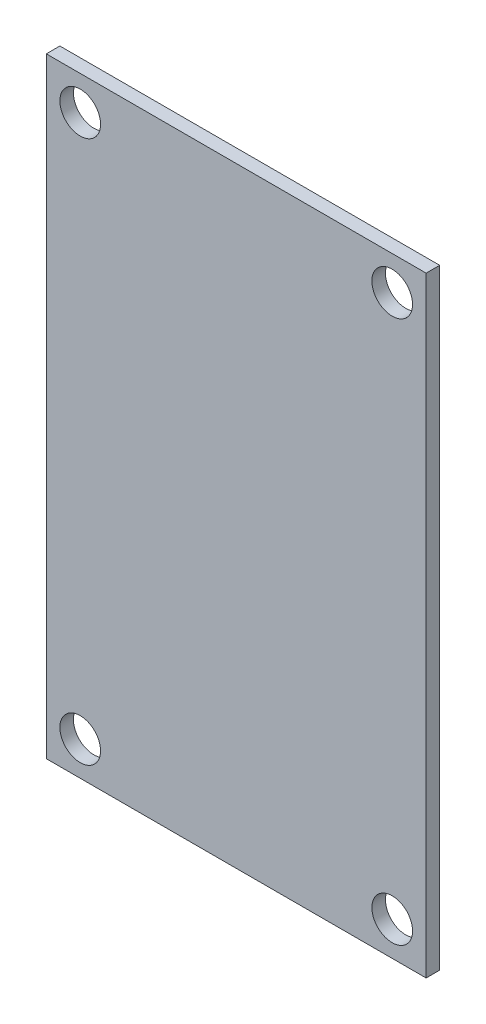
ISO-10303-21;
HEADER;
FILE_DESCRIPTION(('STEP AP214'),'2;1');
FILE_NAME('part.step','',(''),(''),'','','');
FILE_SCHEMA(('AUTOMOTIVE_DESIGN { 1 0 10303 214 1 1 1 1 }'));
ENDSEC;
DATA;
#1=APPLICATION_CONTEXT('core data for automotive mechanical design processes');
#2=APPLICATION_PROTOCOL_DEFINITION('international standard','automotive_design',2000,#1);
#3=PRODUCT_CONTEXT('',#1,'mechanical');
#4=PRODUCT('Part','Part','',(#3));
#5=PRODUCT_RELATED_PRODUCT_CATEGORY('part','',(#4));
#6=PRODUCT_DEFINITION_FORMATION('','',#4);
#7=PRODUCT_DEFINITION_CONTEXT('part definition',#1,'design');
#8=PRODUCT_DEFINITION('design','',#6,#7);
#9=PRODUCT_DEFINITION_SHAPE('','',#8);
#10=(LENGTH_UNIT() NAMED_UNIT(*) SI_UNIT(.MILLI.,.METRE.));
#11=(NAMED_UNIT(*) PLANE_ANGLE_UNIT() SI_UNIT($,.RADIAN.));
#12=(NAMED_UNIT(*) SI_UNIT($,.STERADIAN.) SOLID_ANGLE_UNIT());
#13=UNCERTAINTY_MEASURE_WITH_UNIT(LENGTH_MEASURE(1.E-05),#10,'distance_accuracy_value','');
#14=(GEOMETRIC_REPRESENTATION_CONTEXT(3) GLOBAL_UNCERTAINTY_ASSIGNED_CONTEXT((#13)) GLOBAL_UNIT_ASSIGNED_CONTEXT((#10,
#11,#12)) REPRESENTATION_CONTEXT('',''));
#15=CARTESIAN_POINT('',(0.,0.,0.));
#16=DIRECTION('',(0.,0.,1.));
#17=DIRECTION('',(1.,0.,0.));
#18=AXIS2_PLACEMENT_3D('',#15,#16,#17);
#19=CARTESIAN_POINT('',(0.,0.,1.));
#20=DIRECTION('',(1.,0.,0.));
#21=DIRECTION('',(0.,1.,0.));
#22=AXIS2_PLACEMENT_3D('',#19,#20,#21);
#23=PLANE('',#22);
#24=DIRECTION('',(0.,-1.,0.));
#25=VECTOR('',#24,1.);
#26=CARTESIAN_POINT('',(0.,0.,0.));
#27=LINE('',#26,#25);
#28=CARTESIAN_POINT('',(0.,0.,0.));
#29=VERTEX_POINT('',#28);
#30=CARTESIAN_POINT('',(0.,-45.,0.));
#31=VERTEX_POINT('',#30);
#32=EDGE_CURVE('E97',#29,#31,#27,.T.);
#33=ORIENTED_EDGE('',*,*,#32,.T.);
#34=DIRECTION('',(0.,0.,-1.));
#35=VECTOR('',#34,1.);
#36=CARTESIAN_POINT('',(0.,-45.,1.));
#37=LINE('',#36,#35);
#38=CARTESIAN_POINT('',(0.,-45.,1.));
#39=VERTEX_POINT('',#38);
#40=EDGE_CURVE('E11',#39,#31,#37,.T.);
#41=ORIENTED_EDGE('',*,*,#40,.F.);
#42=DIRECTION('',(0.,-1.,0.));
#43=VECTOR('',#42,1.);
#44=CARTESIAN_POINT('',(0.,0.,1.));
#45=LINE('',#44,#43);
#46=CARTESIAN_POINT('',(0.,0.,1.));
#47=VERTEX_POINT('',#46);
#48=EDGE_CURVE('E85',#47,#39,#45,.T.);
#49=ORIENTED_EDGE('',*,*,#48,.F.);
#50=DIRECTION('',(0.,0.,-1.));
#51=VECTOR('',#50,1.);
#52=CARTESIAN_POINT('',(0.,0.,1.));
#53=LINE('',#52,#51);
#54=EDGE_CURVE('E93',#47,#29,#53,.T.);
#55=ORIENTED_EDGE('',*,*,#54,.T.);
#56=EDGE_LOOP('',(#33,#41,#49,#55));
#57=FACE_BOUND('',#56,.T.);
#58=ADVANCED_FACE('F34',(#57),#23,.F.);
#59=CARTESIAN_POINT('',(0.,-45.,1.));
#60=DIRECTION('',(0.,1.,0.));
#61=DIRECTION('',(0.,0.,1.));
#62=AXIS2_PLACEMENT_3D('',#59,#60,#61);
#63=PLANE('',#62);
#64=DIRECTION('',(1.,0.,0.));
#65=VECTOR('',#64,1.);
#66=CARTESIAN_POINT('',(0.,-45.,0.));
#67=LINE('',#66,#65);
#68=CARTESIAN_POINT('',(28.,-45.,0.));
#69=VERTEX_POINT('',#68);
#70=EDGE_CURVE('E89',#31,#69,#67,.T.);
#71=ORIENTED_EDGE('',*,*,#70,.T.);
#72=DIRECTION('',(0.,0.,-1.));
#73=VECTOR('',#72,1.);
#74=CARTESIAN_POINT('',(28.,-45.,1.));
#75=LINE('',#74,#73);
#76=CARTESIAN_POINT('',(28.,-45.,1.));
#77=VERTEX_POINT('',#76);
#78=EDGE_CURVE('E42',#77,#69,#75,.T.);
#79=ORIENTED_EDGE('',*,*,#78,.F.);
#80=DIRECTION('',(1.,0.,0.));
#81=VECTOR('',#80,1.);
#82=CARTESIAN_POINT('',(0.,-45.,1.));
#83=LINE('',#82,#81);
#84=EDGE_CURVE('E80',#39,#77,#83,.T.);
#85=ORIENTED_EDGE('',*,*,#84,.F.);
#86=ORIENTED_EDGE('',*,*,#40,.T.);
#87=EDGE_LOOP('',(#71,#79,#85,#86));
#88=FACE_BOUND('',#87,.T.);
#89=ADVANCED_FACE('F88',(#88),#63,.F.);
#90=CARTESIAN_POINT('',(28.,0.,1.));
#91=DIRECTION('',(-1.,0.,0.));
#92=DIRECTION('',(0.,-1.,0.));
#93=AXIS2_PLACEMENT_3D('',#90,#91,#92);
#94=PLANE('',#93);
#95=DIRECTION('',(0.,1.,0.));
#96=VECTOR('',#95,1.);
#97=CARTESIAN_POINT('',(28.,0.,0.));
#98=LINE('',#97,#96);
#99=CARTESIAN_POINT('',(28.,0.,0.));
#100=VERTEX_POINT('',#99);
#101=EDGE_CURVE('E67',#69,#100,#98,.T.);
#102=ORIENTED_EDGE('',*,*,#101,.T.);
#103=DIRECTION('',(0.,0.,-1.));
#104=VECTOR('',#103,1.);
#105=CARTESIAN_POINT('',(28.,0.,1.));
#106=LINE('',#105,#104);
#107=CARTESIAN_POINT('',(28.,0.,1.));
#108=VERTEX_POINT('',#107);
#109=EDGE_CURVE('E90',#108,#100,#106,.T.);
#110=ORIENTED_EDGE('',*,*,#109,.F.);
#111=DIRECTION('',(0.,1.,0.));
#112=VECTOR('',#111,1.);
#113=CARTESIAN_POINT('',(28.,0.,1.));
#114=LINE('',#113,#112);
#115=EDGE_CURVE('E83',#77,#108,#114,.T.);
#116=ORIENTED_EDGE('',*,*,#115,.F.);
#117=ORIENTED_EDGE('',*,*,#78,.T.);
#118=EDGE_LOOP('',(#102,#110,#116,#117));
#119=FACE_BOUND('',#118,.T.);
#120=ADVANCED_FACE('F91',(#119),#94,.F.);
#121=CARTESIAN_POINT('',(0.,0.,1.));
#122=DIRECTION('',(0.,-1.,0.));
#123=DIRECTION('',(0.,0.,-1.));
#124=AXIS2_PLACEMENT_3D('',#121,#122,#123);
#125=PLANE('',#124);
#126=DIRECTION('',(-1.,0.,0.));
#127=VECTOR('',#126,1.);
#128=CARTESIAN_POINT('',(0.,0.,0.));
#129=LINE('',#128,#127);
#130=EDGE_CURVE('E73',#100,#29,#129,.T.);
#131=ORIENTED_EDGE('',*,*,#130,.T.);
#132=ORIENTED_EDGE('',*,*,#54,.F.);
#133=DIRECTION('',(-1.,0.,0.));
#134=VECTOR('',#133,1.);
#135=CARTESIAN_POINT('',(0.,0.,1.));
#136=LINE('',#135,#134);
#137=EDGE_CURVE('E50',#108,#47,#136,.T.);
#138=ORIENTED_EDGE('',*,*,#137,.F.);
#139=ORIENTED_EDGE('',*,*,#109,.T.);
#140=EDGE_LOOP('',(#131,#132,#138,#139));
#141=FACE_BOUND('',#140,.T.);
#142=ADVANCED_FACE('F105',(#141),#125,.F.);
#143=CARTESIAN_POINT('',(0.,0.,1.));
#144=DIRECTION('',(0.,0.,1.));
#145=DIRECTION('',(1.,0.,0.));
#146=AXIS2_PLACEMENT_3D('',#143,#144,#145);
#147=PLANE('',#146);
#148=CARTESIAN_POINT('',(25.5,-2.49999999999998,1.));
#149=DIRECTION('',(0.,0.,1.));
#150=DIRECTION('',(1.,0.,0.));
#151=AXIS2_PLACEMENT_3D('',#148,#149,#150);
#152=CIRCLE('',#151,1.5);
#153=CARTESIAN_POINT('',(27.,-2.49999999999998,1.));
#154=VERTEX_POINT('',#153);
#155=EDGE_CURVE('E129',#154,#154,#152,.T.);
#156=ORIENTED_EDGE('',*,*,#155,.F.);
#157=EDGE_LOOP('',(#156));
#158=FACE_BOUND('',#157,.T.);
#159=CARTESIAN_POINT('',(25.5,-42.5,1.));
#160=DIRECTION('',(0.,0.,1.));
#161=DIRECTION('',(-1.,0.,0.));
#162=AXIS2_PLACEMENT_3D('',#159,#160,#161);
#163=CIRCLE('',#162,1.5);
#164=CARTESIAN_POINT('',(24.,-42.5,1.));
#165=VERTEX_POINT('',#164);
#166=EDGE_CURVE('E123',#165,#165,#163,.T.);
#167=ORIENTED_EDGE('',*,*,#166,.F.);
#168=EDGE_LOOP('',(#167));
#169=FACE_BOUND('',#168,.T.);
#170=CARTESIAN_POINT('',(2.50000000000002,-2.49999999999999,1.));
#171=DIRECTION('',(0.,0.,1.));
#172=DIRECTION('',(-1.,0.,0.));
#173=AXIS2_PLACEMENT_3D('',#170,#171,#172);
#174=CIRCLE('',#173,1.5);
#175=CARTESIAN_POINT('',(1.00000000000002,-2.49999999999999,1.));
#176=VERTEX_POINT('',#175);
#177=EDGE_CURVE('E117',#176,#176,#174,.T.);
#178=ORIENTED_EDGE('',*,*,#177,.F.);
#179=EDGE_LOOP('',(#178));
#180=FACE_BOUND('',#179,.T.);
#181=CARTESIAN_POINT('',(2.5,-42.5,1.));
#182=DIRECTION('',(0.,0.,1.));
#183=DIRECTION('',(1.,0.,0.));
#184=AXIS2_PLACEMENT_3D('',#181,#182,#183);
#185=CIRCLE('',#184,1.5);
#186=CARTESIAN_POINT('',(4.,-42.5,1.));
#187=VERTEX_POINT('',#186);
#188=EDGE_CURVE('E111',#187,#187,#185,.T.);
#189=ORIENTED_EDGE('',*,*,#188,.F.);
#190=EDGE_LOOP('',(#189));
#191=FACE_BOUND('',#190,.T.);
#192=ORIENTED_EDGE('',*,*,#48,.T.);
#193=ORIENTED_EDGE('',*,*,#84,.T.);
#194=ORIENTED_EDGE('',*,*,#115,.T.);
#195=ORIENTED_EDGE('',*,*,#137,.T.);
#196=EDGE_LOOP('',(#192,#193,#194,#195));
#197=FACE_BOUND('',#196,.T.);
#198=ADVANCED_FACE('F81',(#158,#169,#180,#191,#197),#147,.T.);
#199=CARTESIAN_POINT('',(0.,0.,0.));
#200=DIRECTION('',(0.,0.,1.));
#201=DIRECTION('',(1.,0.,0.));
#202=AXIS2_PLACEMENT_3D('',#199,#200,#201);
#203=PLANE('',#202);
#204=CARTESIAN_POINT('',(25.5,-2.49999999999998,0.));
#205=DIRECTION('',(0.,0.,1.));
#206=DIRECTION('',(1.,0.,0.));
#207=AXIS2_PLACEMENT_3D('',#204,#205,#206);
#208=CIRCLE('',#207,1.5);
#209=CARTESIAN_POINT('',(27.,-2.49999999999998,0.));
#210=VERTEX_POINT('',#209);
#211=EDGE_CURVE('E126',#210,#210,#208,.T.);
#212=ORIENTED_EDGE('',*,*,#211,.T.);
#213=EDGE_LOOP('',(#212));
#214=FACE_BOUND('',#213,.T.);
#215=CARTESIAN_POINT('',(25.5,-42.5,0.));
#216=DIRECTION('',(0.,0.,1.));
#217=DIRECTION('',(-1.,0.,0.));
#218=AXIS2_PLACEMENT_3D('',#215,#216,#217);
#219=CIRCLE('',#218,1.5);
#220=CARTESIAN_POINT('',(24.,-42.5,0.));
#221=VERTEX_POINT('',#220);
#222=EDGE_CURVE('E120',#221,#221,#219,.T.);
#223=ORIENTED_EDGE('',*,*,#222,.T.);
#224=EDGE_LOOP('',(#223));
#225=FACE_BOUND('',#224,.T.);
#226=CARTESIAN_POINT('',(2.50000000000002,-2.49999999999999,0.));
#227=DIRECTION('',(0.,0.,1.));
#228=DIRECTION('',(-1.,0.,0.));
#229=AXIS2_PLACEMENT_3D('',#226,#227,#228);
#230=CIRCLE('',#229,1.5);
#231=CARTESIAN_POINT('',(1.00000000000002,-2.49999999999999,0.));
#232=VERTEX_POINT('',#231);
#233=EDGE_CURVE('E114',#232,#232,#230,.T.);
#234=ORIENTED_EDGE('',*,*,#233,.T.);
#235=EDGE_LOOP('',(#234));
#236=FACE_BOUND('',#235,.T.);
#237=CARTESIAN_POINT('',(2.5,-42.5,0.));
#238=DIRECTION('',(0.,0.,1.));
#239=DIRECTION('',(1.,0.,0.));
#240=AXIS2_PLACEMENT_3D('',#237,#238,#239);
#241=CIRCLE('',#240,1.5);
#242=CARTESIAN_POINT('',(4.,-42.5,0.));
#243=VERTEX_POINT('',#242);
#244=EDGE_CURVE('E100',#243,#243,#241,.T.);
#245=ORIENTED_EDGE('',*,*,#244,.T.);
#246=EDGE_LOOP('',(#245));
#247=FACE_BOUND('',#246,.T.);
#248=ORIENTED_EDGE('',*,*,#32,.F.);
#249=ORIENTED_EDGE('',*,*,#130,.F.);
#250=ORIENTED_EDGE('',*,*,#101,.F.);
#251=ORIENTED_EDGE('',*,*,#70,.F.);
#252=EDGE_LOOP('',(#248,#249,#250,#251));
#253=FACE_BOUND('',#252,.T.);
#254=ADVANCED_FACE('F108',(#214,#225,#236,#247,#253),#203,.F.);
#255=CARTESIAN_POINT('',(2.5,-42.5,0.));
#256=DIRECTION('',(0.,0.,1.));
#257=DIRECTION('',(1.,0.,0.));
#258=AXIS2_PLACEMENT_3D('',#255,#256,#257);
#259=CYLINDRICAL_SURFACE('',#258,1.5);
#260=ORIENTED_EDGE('',*,*,#244,.F.);
#261=EDGE_LOOP('',(#260));
#262=FACE_BOUND('',#261,.T.);
#263=ORIENTED_EDGE('',*,*,#188,.T.);
#264=EDGE_LOOP('',(#263));
#265=FACE_BOUND('',#264,.T.);
#266=ADVANCED_FACE('F153',(#262,#265),#259,.F.);
#267=CARTESIAN_POINT('',(2.50000000000002,-2.49999999999999,0.));
#268=DIRECTION('',(0.,0.,1.));
#269=DIRECTION('',(1.,0.,0.));
#270=AXIS2_PLACEMENT_3D('',#267,#268,#269);
#271=CYLINDRICAL_SURFACE('',#270,1.5);
#272=ORIENTED_EDGE('',*,*,#233,.F.);
#273=EDGE_LOOP('',(#272));
#274=FACE_BOUND('',#273,.T.);
#275=ORIENTED_EDGE('',*,*,#177,.T.);
#276=EDGE_LOOP('',(#275));
#277=FACE_BOUND('',#276,.T.);
#278=ADVANCED_FACE('F155',(#274,#277),#271,.F.);
#279=CARTESIAN_POINT('',(25.5,-42.5,0.));
#280=DIRECTION('',(0.,0.,1.));
#281=DIRECTION('',(1.,0.,0.));
#282=AXIS2_PLACEMENT_3D('',#279,#280,#281);
#283=CYLINDRICAL_SURFACE('',#282,1.5);
#284=ORIENTED_EDGE('',*,*,#222,.F.);
#285=EDGE_LOOP('',(#284));
#286=FACE_BOUND('',#285,.T.);
#287=ORIENTED_EDGE('',*,*,#166,.T.);
#288=EDGE_LOOP('',(#287));
#289=FACE_BOUND('',#288,.T.);
#290=ADVANCED_FACE('F140',(#286,#289),#283,.F.);
#291=CARTESIAN_POINT('',(25.5,-2.49999999999998,0.));
#292=DIRECTION('',(0.,0.,1.));
#293=DIRECTION('',(1.,0.,0.));
#294=AXIS2_PLACEMENT_3D('',#291,#292,#293);
#295=CYLINDRICAL_SURFACE('',#294,1.5);
#296=ORIENTED_EDGE('',*,*,#211,.F.);
#297=EDGE_LOOP('',(#296));
#298=FACE_BOUND('',#297,.T.);
#299=ORIENTED_EDGE('',*,*,#155,.T.);
#300=EDGE_LOOP('',(#299));
#301=FACE_BOUND('',#300,.T.);
#302=ADVANCED_FACE('F137',(#298,#301),#295,.F.);
#303=CLOSED_SHELL('',(#58,#89,#120,#142,#198,#254,#266,#278,#290,#302));
#304=MANIFOLD_SOLID_BREP('B2',#303);
#305=ADVANCED_BREP_SHAPE_REPRESENTATION('',(#18,#304),#14);
#306=SHAPE_DEFINITION_REPRESENTATION(#9,#305);
ENDSEC;
END-ISO-10303-21;
